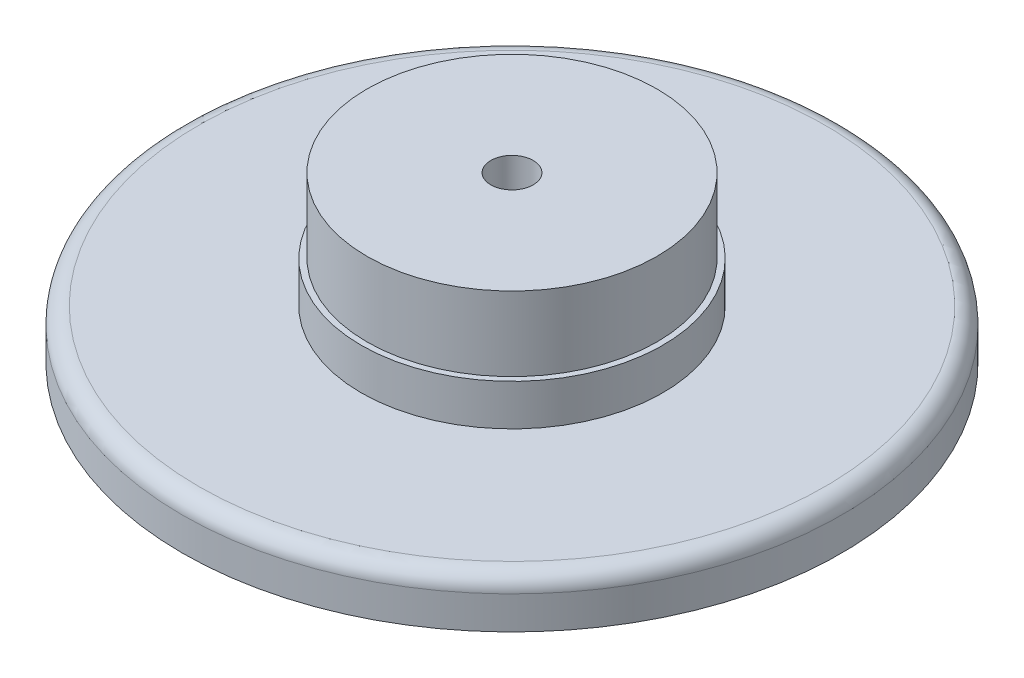
ISO-10303-21;
HEADER;
FILE_DESCRIPTION(('STEP AP214'),'2;1');
FILE_NAME('part.step','',(''),(''),'','','');
FILE_SCHEMA(('AUTOMOTIVE_DESIGN { 1 0 10303 214 1 1 1 1 }'));
ENDSEC;
DATA;
#1=APPLICATION_CONTEXT('core data for automotive mechanical design processes');
#2=APPLICATION_PROTOCOL_DEFINITION('international standard','automotive_design',2000,#1);
#3=PRODUCT_CONTEXT('',#1,'mechanical');
#4=PRODUCT('Part','Part','',(#3));
#5=PRODUCT_RELATED_PRODUCT_CATEGORY('part','',(#4));
#6=PRODUCT_DEFINITION_FORMATION('','',#4);
#7=PRODUCT_DEFINITION_CONTEXT('part definition',#1,'design');
#8=PRODUCT_DEFINITION('design','',#6,#7);
#9=PRODUCT_DEFINITION_SHAPE('','',#8);
#10=(LENGTH_UNIT() NAMED_UNIT(*) SI_UNIT(.MILLI.,.METRE.));
#11=(NAMED_UNIT(*) PLANE_ANGLE_UNIT() SI_UNIT($,.RADIAN.));
#12=(NAMED_UNIT(*) SI_UNIT($,.STERADIAN.) SOLID_ANGLE_UNIT());
#13=UNCERTAINTY_MEASURE_WITH_UNIT(LENGTH_MEASURE(1.E-05),#10,'distance_accuracy_value','');
#14=(GEOMETRIC_REPRESENTATION_CONTEXT(3) GLOBAL_UNCERTAINTY_ASSIGNED_CONTEXT((#13)) GLOBAL_UNIT_ASSIGNED_CONTEXT((#10,
#11,#12)) REPRESENTATION_CONTEXT('',''));
#15=CARTESIAN_POINT('',(0.,0.,0.));
#16=DIRECTION('',(0.,0.,1.));
#17=DIRECTION('',(1.,0.,0.));
#18=AXIS2_PLACEMENT_3D('',#15,#16,#17);
#19=CARTESIAN_POINT('',(0.,7.62,0.));
#20=DIRECTION('',(0.,-1.,0.));
#21=DIRECTION('',(0.,0.,-1.));
#22=AXIS2_PLACEMENT_3D('',#19,#20,#21);
#23=CYLINDRICAL_SURFACE('',#22,50.8);
#24=CARTESIAN_POINT('',(0.,5.08,0.));
#25=DIRECTION('',(0.,1.,0.));
#26=DIRECTION('',(0.,0.,1.));
#27=AXIS2_PLACEMENT_3D('',#24,#25,#26);
#28=CIRCLE('',#27,50.8);
#29=CARTESIAN_POINT('',(0.,5.08,-50.8));
#30=VERTEX_POINT('',#29);
#31=EDGE_CURVE('E10',#30,#30,#28,.F.);
#32=CARTESIAN_POINT('',(0.,0.,0.));
#33=DIRECTION('',(0.,1.,0.));
#34=DIRECTION('',(0.,0.,1.));
#35=AXIS2_PLACEMENT_3D('',#32,#33,#34);
#36=CIRCLE('',#35,50.8);
#37=CARTESIAN_POINT('',(0.,0.,-50.8));
#38=VERTEX_POINT('',#37);
#39=EDGE_CURVE('E61',#38,#38,#36,.T.);
#40=CARTESIAN_POINT('',(0.,5.08,-50.8));
#41=CARTESIAN_POINT('',(0.,5.02708333333333,-50.8));
#42=CARTESIAN_POINT('',(0.,4.97416666666667,-50.8));
#43=CARTESIAN_POINT('',(0.,4.86833333333333,-50.8));
#44=CARTESIAN_POINT('',(0.,4.81541666666667,-50.8));
#45=CARTESIAN_POINT('',(0.,4.70958333333333,-50.8));
#46=CARTESIAN_POINT('',(0.,4.65666666666667,-50.8));
#47=CARTESIAN_POINT('',(0.,4.55083333333333,-50.8));
#48=CARTESIAN_POINT('',(0.,4.49791666666667,-50.8));
#49=CARTESIAN_POINT('',(0.,4.39208333333333,-50.8));
#50=CARTESIAN_POINT('',(0.,4.33916666666667,-50.8));
#51=CARTESIAN_POINT('',(0.,4.23333333333333,-50.8));
#52=CARTESIAN_POINT('',(0.,4.18041666666667,-50.8));
#53=CARTESIAN_POINT('',(0.,4.07458333333333,-50.8));
#54=CARTESIAN_POINT('',(0.,4.02166666666667,-50.8));
#55=CARTESIAN_POINT('',(0.,3.91583333333333,-50.8));
#56=CARTESIAN_POINT('',(0.,3.86291666666667,-50.8));
#57=CARTESIAN_POINT('',(0.,3.75708333333333,-50.8));
#58=CARTESIAN_POINT('',(0.,3.70416666666667,-50.8));
#59=CARTESIAN_POINT('',(0.,3.59833333333333,-50.8));
#60=CARTESIAN_POINT('',(0.,3.54541666666667,-50.8));
#61=CARTESIAN_POINT('',(0.,3.43958333333333,-50.8));
#62=CARTESIAN_POINT('',(0.,3.38666666666667,-50.8));
#63=CARTESIAN_POINT('',(0.,3.28083333333333,-50.8));
#64=CARTESIAN_POINT('',(0.,3.22791666666667,-50.8));
#65=CARTESIAN_POINT('',(0.,3.12208333333333,-50.8));
#66=CARTESIAN_POINT('',(0.,3.06916666666667,-50.8));
#67=CARTESIAN_POINT('',(0.,2.96333333333333,-50.8));
#68=CARTESIAN_POINT('',(0.,2.91041666666667,-50.8));
#69=CARTESIAN_POINT('',(0.,2.80458333333333,-50.8));
#70=CARTESIAN_POINT('',(0.,2.75166666666667,-50.8));
#71=CARTESIAN_POINT('',(0.,2.64583333333333,-50.8));
#72=CARTESIAN_POINT('',(0.,2.59291666666667,-50.8));
#73=CARTESIAN_POINT('',(0.,2.48708333333333,-50.8));
#74=CARTESIAN_POINT('',(0.,2.43416666666667,-50.8));
#75=CARTESIAN_POINT('',(0.,2.32833333333333,-50.8));
#76=CARTESIAN_POINT('',(0.,2.27541666666667,-50.8));
#77=CARTESIAN_POINT('',(0.,2.16958333333333,-50.8));
#78=CARTESIAN_POINT('',(0.,2.11666666666667,-50.8));
#79=CARTESIAN_POINT('',(0.,2.01083333333333,-50.8));
#80=CARTESIAN_POINT('',(0.,1.95791666666667,-50.8));
#81=CARTESIAN_POINT('',(0.,1.85208333333333,-50.8));
#82=CARTESIAN_POINT('',(0.,1.79916666666667,-50.8));
#83=CARTESIAN_POINT('',(0.,1.69333333333333,-50.8));
#84=CARTESIAN_POINT('',(0.,1.64041666666667,-50.8));
#85=CARTESIAN_POINT('',(0.,1.53458333333333,-50.8));
#86=CARTESIAN_POINT('',(0.,1.48166666666667,-50.8));
#87=CARTESIAN_POINT('',(0.,1.37583333333333,-50.8));
#88=CARTESIAN_POINT('',(0.,1.32291666666667,-50.8));
#89=CARTESIAN_POINT('',(0.,1.21708333333333,-50.8));
#90=CARTESIAN_POINT('',(0.,1.16416666666667,-50.8));
#91=CARTESIAN_POINT('',(0.,1.05833333333333,-50.8));
#92=CARTESIAN_POINT('',(0.,1.00541666666667,-50.8));
#93=CARTESIAN_POINT('',(0.,0.899583333333334,-50.8));
#94=CARTESIAN_POINT('',(0.,0.846666666666667,-50.8));
#95=CARTESIAN_POINT('',(0.,0.740833333333333,-50.8));
#96=CARTESIAN_POINT('',(0.,0.687916666666667,-50.8));
#97=CARTESIAN_POINT('',(0.,0.582083333333333,-50.8));
#98=CARTESIAN_POINT('',(0.,0.529166666666667,-50.8));
#99=CARTESIAN_POINT('',(0.,0.423333333333333,-50.8));
#100=CARTESIAN_POINT('',(0.,0.370416666666667,-50.8));
#101=CARTESIAN_POINT('',(0.,0.264583333333333,-50.8));
#102=CARTESIAN_POINT('',(0.,0.211666666666667,-50.8));
#103=CARTESIAN_POINT('',(0.,0.105833333333333,-50.8));
#104=CARTESIAN_POINT('',(0.,0.0529166666666667,-50.8));
#105=CARTESIAN_POINT('',(0.,0.,-50.8));
#106=B_SPLINE_CURVE_WITH_KNOTS('',3,(#40,#41,#42,#43,#44,#45,#46,#47,#48,#49,#50,#51,#52,#53,
#54,#55,#56,#57,#58,#59,#60,#61,#62,#63,#64,#65,#66,#67,#68,#69,#70,#71,#72,#73,#74,#75,#76,#77,
#78,#79,#80,#81,#82,#83,#84,#85,#86,#87,#88,#89,#90,#91,#92,#93,#94,#95,#96,#97,#98,#99,#100,
#101,#102,#103,#104,#105),.UNSPECIFIED.,.F.,.F.,(4,2,2,2,2,2,2,2,2,2,2,2,2,2,2,2,2,2,2,2,2,2,2,
2,2,2,2,2,2,2,2,2,4),(0.,0.158750000000001,0.3175,0.476250000000001,0.635,0.793750000000001,
0.9525,1.11125,1.27,1.42875,1.5875,1.74625,1.905,2.06375,2.2225,2.38125,2.54,2.69875,2.8575,
3.01625,3.175,3.33375,3.4925,3.65125,3.81,3.96875,4.1275,4.28625,4.445,4.60375,4.7625,4.92125,
5.08),.UNSPECIFIED.);
#107=EDGE_CURVE('BSEAM43',#30,#38,#106,.T.);
#108=ORIENTED_EDGE('',*,*,#31,.T.);
#109=ORIENTED_EDGE('',*,*,#39,.T.);
#110=ORIENTED_EDGE('',*,*,#107,.T.);
#111=ORIENTED_EDGE('',*,*,#107,.F.);
#112=EDGE_LOOP('',(#108,#110,#109,#111));
#113=FACE_BOUND('',#112,.T.);
#114=ADVANCED_FACE('F43',(#113),#23,.T.);
#115=CARTESIAN_POINT('',(0.,7.62,0.));
#116=DIRECTION('',(0.,1.,0.));
#117=DIRECTION('',(0.,0.,1.));
#118=AXIS2_PLACEMENT_3D('',#115,#116,#117);
#119=PLANE('',#118);
#120=CARTESIAN_POINT('',(0.,7.62,0.));
#121=DIRECTION('',(0.,1.,0.));
#122=DIRECTION('',(0.,0.,1.));
#123=AXIS2_PLACEMENT_3D('',#120,#121,#122);
#124=CIRCLE('',#123,48.26);
#125=CARTESIAN_POINT('',(0.,7.62,48.26));
#126=VERTEX_POINT('',#125);
#127=EDGE_CURVE('E51',#126,#126,#124,.T.);
#128=ORIENTED_EDGE('',*,*,#127,.T.);
#129=EDGE_LOOP('',(#128));
#130=FACE_BOUND('',#129,.T.);
#131=CARTESIAN_POINT('',(0.,7.62,0.));
#132=DIRECTION('',(0.,1.,0.));
#133=DIRECTION('',(0.,0.,1.));
#134=AXIS2_PLACEMENT_3D('',#131,#132,#133);
#135=CIRCLE('',#134,23.241);
#136=CARTESIAN_POINT('',(0.,7.62,23.241));
#137=VERTEX_POINT('',#136);
#138=EDGE_CURVE('E56',#137,#137,#135,.T.);
#139=ORIENTED_EDGE('',*,*,#138,.F.);
#140=EDGE_LOOP('',(#139));
#141=FACE_BOUND('',#140,.T.);
#142=ADVANCED_FACE('F98',(#130,#141),#119,.T.);
#143=CARTESIAN_POINT('',(0.,0.,0.));
#144=DIRECTION('',(0.,1.,0.));
#145=DIRECTION('',(0.,0.,1.));
#146=AXIS2_PLACEMENT_3D('',#143,#144,#145);
#147=PLANE('',#146);
#148=CARTESIAN_POINT('',(0.,0.,0.));
#149=DIRECTION('',(0.,-1.,0.));
#150=DIRECTION('',(0.,0.,-1.));
#151=AXIS2_PLACEMENT_3D('',#148,#149,#150);
#152=CIRCLE('',#151,6.4389);
#153=CARTESIAN_POINT('',(0.,0.,-6.4389));
#154=VERTEX_POINT('',#153);
#155=EDGE_CURVE('E87',#154,#154,#152,.T.);
#156=ORIENTED_EDGE('',*,*,#155,.F.);
#157=EDGE_LOOP('',(#156));
#158=FACE_BOUND('',#157,.T.);
#159=ORIENTED_EDGE('',*,*,#39,.F.);
#160=EDGE_LOOP('',(#159));
#161=FACE_BOUND('',#160,.T.);
#162=ADVANCED_FACE('F94',(#158,#161),#147,.F.);
#163=CARTESIAN_POINT('',(0.,13.97,0.));
#164=DIRECTION('',(0.,-1.,0.));
#165=DIRECTION('',(0.,0.,-1.));
#166=AXIS2_PLACEMENT_3D('',#163,#164,#165);
#167=CYLINDRICAL_SURFACE('',#166,23.241);
#168=ORIENTED_EDGE('',*,*,#138,.T.);
#169=EDGE_LOOP('',(#168));
#170=FACE_BOUND('',#169,.T.);
#171=CARTESIAN_POINT('',(0.,13.97,0.));
#172=DIRECTION('',(0.,1.,0.));
#173=DIRECTION('',(0.,0.,1.));
#174=AXIS2_PLACEMENT_3D('',#171,#172,#173);
#175=CIRCLE('',#174,23.241);
#176=CARTESIAN_POINT('',(0.,13.97,23.241));
#177=VERTEX_POINT('',#176);
#178=EDGE_CURVE('E66',#177,#177,#175,.T.);
#179=ORIENTED_EDGE('',*,*,#178,.F.);
#180=EDGE_LOOP('',(#179));
#181=FACE_BOUND('',#180,.T.);
#182=ADVANCED_FACE('F97',(#170,#181),#167,.T.);
#183=CARTESIAN_POINT('',(0.,13.97,0.));
#184=DIRECTION('',(0.,1.,0.));
#185=DIRECTION('',(0.,0.,1.));
#186=AXIS2_PLACEMENT_3D('',#183,#184,#185);
#187=PLANE('',#186);
#188=CARTESIAN_POINT('',(0.,13.97,0.));
#189=DIRECTION('',(0.,1.,0.));
#190=DIRECTION('',(0.,0.,1.));
#191=AXIS2_PLACEMENT_3D('',#188,#189,#190);
#192=CIRCLE('',#191,22.352);
#193=CARTESIAN_POINT('',(0.,13.97,22.352));
#194=VERTEX_POINT('',#193);
#195=EDGE_CURVE('E71',#194,#194,#192,.T.);
#196=ORIENTED_EDGE('',*,*,#195,.F.);
#197=EDGE_LOOP('',(#196));
#198=FACE_BOUND('',#197,.T.);
#199=ORIENTED_EDGE('',*,*,#178,.T.);
#200=EDGE_LOOP('',(#199));
#201=FACE_BOUND('',#200,.T.);
#202=ADVANCED_FACE('F110',(#198,#201),#187,.T.);
#203=CARTESIAN_POINT('',(0.,25.4,0.));
#204=DIRECTION('',(0.,1.,0.));
#205=DIRECTION('',(0.,0.,1.));
#206=AXIS2_PLACEMENT_3D('',#203,#204,#205);
#207=PLANE('',#206);
#208=CARTESIAN_POINT('',(0.,25.4,0.));
#209=DIRECTION('',(0.,-1.,0.));
#210=DIRECTION('',(0.,0.,-1.));
#211=AXIS2_PLACEMENT_3D('',#208,#209,#210);
#212=CIRCLE('',#211,3.26389999999999);
#213=CARTESIAN_POINT('',(0.,25.4,-3.26389999999999));
#214=VERTEX_POINT('',#213);
#215=EDGE_CURVE('E79',#214,#214,#212,.T.);
#216=ORIENTED_EDGE('',*,*,#215,.T.);
#217=EDGE_LOOP('',(#216));
#218=FACE_BOUND('',#217,.T.);
#219=CARTESIAN_POINT('',(0.,25.4,0.));
#220=DIRECTION('',(0.,1.,0.));
#221=DIRECTION('',(0.,0.,1.));
#222=AXIS2_PLACEMENT_3D('',#219,#220,#221);
#223=CIRCLE('',#222,22.352);
#224=CARTESIAN_POINT('',(0.,25.4,22.352));
#225=VERTEX_POINT('',#224);
#226=EDGE_CURVE('E75',#225,#225,#223,.T.);
#227=ORIENTED_EDGE('',*,*,#226,.T.);
#228=EDGE_LOOP('',(#227));
#229=FACE_BOUND('',#228,.T.);
#230=ADVANCED_FACE('F114',(#218,#229),#207,.T.);
#231=CARTESIAN_POINT('',(0.,25.4,0.));
#232=DIRECTION('',(0.,-1.,0.));
#233=DIRECTION('',(0.,0.,-1.));
#234=AXIS2_PLACEMENT_3D('',#231,#232,#233);
#235=CYLINDRICAL_SURFACE('',#234,22.352);
#236=ORIENTED_EDGE('',*,*,#195,.T.);
#237=EDGE_LOOP('',(#236));
#238=FACE_BOUND('',#237,.T.);
#239=ORIENTED_EDGE('',*,*,#226,.F.);
#240=EDGE_LOOP('',(#239));
#241=FACE_BOUND('',#240,.T.);
#242=ADVANCED_FACE('F116',(#238,#241),#235,.T.);
#243=CARTESIAN_POINT('',(0.,0.,0.));
#244=DIRECTION('',(0.,-1.,0.));
#245=DIRECTION('',(0.,0.,-1.));
#246=AXIS2_PLACEMENT_3D('',#243,#244,#245);
#247=CYLINDRICAL_SURFACE('',#246,3.26389999999999);
#248=ORIENTED_EDGE('',*,*,#215,.F.);
#249=EDGE_LOOP('',(#248));
#250=FACE_BOUND('',#249,.T.);
#251=CARTESIAN_POINT('',(0.,2.66414132898787,0.));
#252=DIRECTION('',(0.,-1.,0.));
#253=DIRECTION('',(0.,0.,-1.));
#254=AXIS2_PLACEMENT_3D('',#251,#252,#253);
#255=CIRCLE('',#254,3.2639);
#256=CARTESIAN_POINT('',(0.,2.66414132898787,-3.2639));
#257=VERTEX_POINT('',#256);
#258=EDGE_CURVE('E83',#257,#257,#255,.T.);
#259=ORIENTED_EDGE('',*,*,#258,.T.);
#260=EDGE_LOOP('',(#259));
#261=FACE_BOUND('',#260,.T.);
#262=ADVANCED_FACE('F119',(#250,#261),#247,.F.);
#263=CARTESIAN_POINT('',(0.,0.,0.));
#264=DIRECTION('',(0.,-1.,0.));
#265=DIRECTION('',(0.,0.,-1.));
#266=AXIS2_PLACEMENT_3D('',#263,#264,#265);
#267=CONICAL_SURFACE('',#266,6.4389,0.872664625997165);
#268=ORIENTED_EDGE('',*,*,#258,.F.);
#269=EDGE_LOOP('',(#268));
#270=FACE_BOUND('',#269,.T.);
#271=ORIENTED_EDGE('',*,*,#155,.T.);
#272=EDGE_LOOP('',(#271));
#273=FACE_BOUND('',#272,.T.);
#274=ADVANCED_FACE('F92',(#270,#273),#267,.F.);
#275=CARTESIAN_POINT('',(0.,5.08,0.));
#276=DIRECTION('',(0.,1.,0.));
#277=DIRECTION('',(0.,0.,1.));
#278=AXIS2_PLACEMENT_3D('',#275,#276,#277);
#279=TOROIDAL_SURFACE('',#278,48.26,2.54);
#280=ORIENTED_EDGE('',*,*,#31,.F.);
#281=EDGE_LOOP('',(#280));
#282=FACE_BOUND('',#281,.T.);
#283=ORIENTED_EDGE('',*,*,#127,.F.);
#284=EDGE_LOOP('',(#283));
#285=FACE_BOUND('',#284,.T.);
#286=ADVANCED_FACE('F45',(#282,#285),#279,.T.);
#287=CLOSED_SHELL('',(#114,#142,#162,#182,#202,#230,#242,#262,#274,#286));
#288=MANIFOLD_SOLID_BREP('B2',#287);
#289=ADVANCED_BREP_SHAPE_REPRESENTATION('',(#18,#288),#14);
#290=SHAPE_DEFINITION_REPRESENTATION(#9,#289);
ENDSEC;
END-ISO-10303-21;
